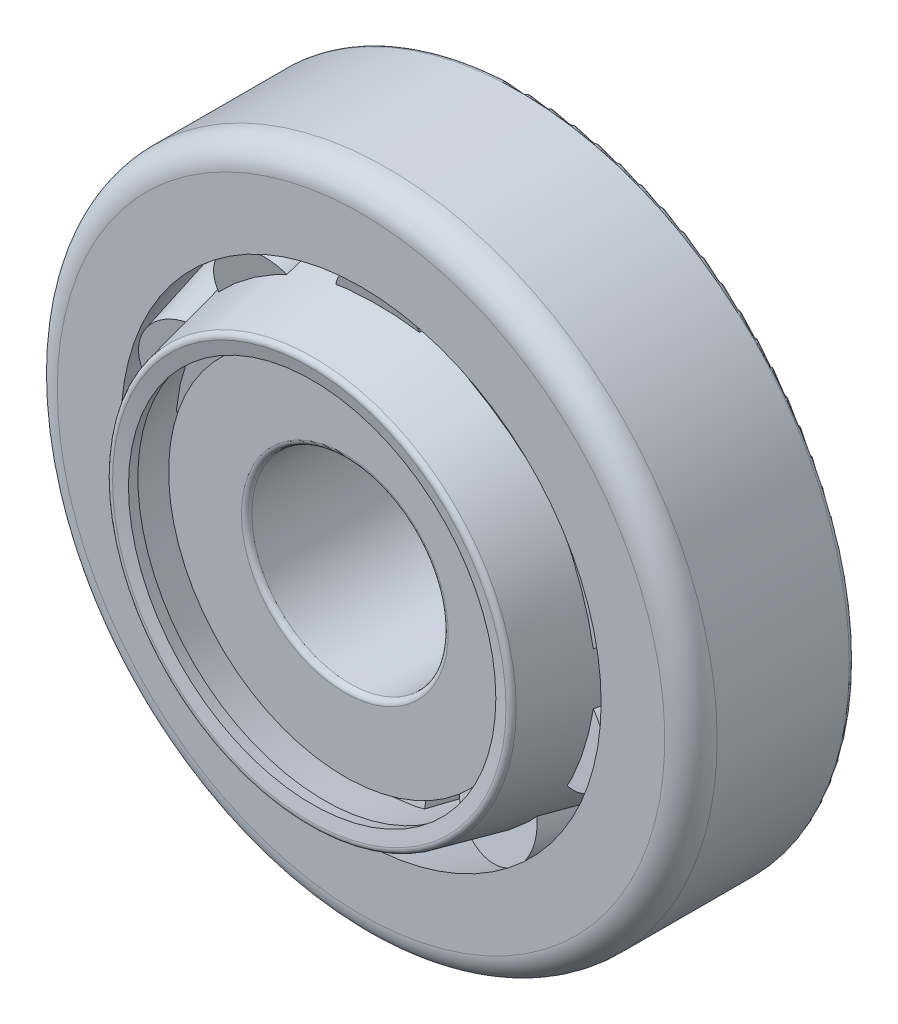
ISO-10303-21;
HEADER;
FILE_DESCRIPTION(('STEP AP214'),'2;1');
FILE_NAME('part.step','',(''),(''),'','','');
FILE_SCHEMA(('AUTOMOTIVE_DESIGN { 1 0 10303 214 1 1 1 1 }'));
ENDSEC;
DATA;
#1=APPLICATION_CONTEXT('core data for automotive mechanical design processes');
#2=APPLICATION_PROTOCOL_DEFINITION('international standard','automotive_design',2000,#1);
#3=PRODUCT_CONTEXT('',#1,'mechanical');
#4=PRODUCT('Part','Part','',(#3));
#5=PRODUCT_RELATED_PRODUCT_CATEGORY('part','',(#4));
#6=PRODUCT_DEFINITION_FORMATION('','',#4);
#7=PRODUCT_DEFINITION_CONTEXT('part definition',#1,'design');
#8=PRODUCT_DEFINITION('design','',#6,#7);
#9=PRODUCT_DEFINITION_SHAPE('','',#8);
#10=(LENGTH_UNIT() NAMED_UNIT(*) SI_UNIT(.MILLI.,.METRE.));
#11=(NAMED_UNIT(*) PLANE_ANGLE_UNIT() SI_UNIT($,.RADIAN.));
#12=(NAMED_UNIT(*) SI_UNIT($,.STERADIAN.) SOLID_ANGLE_UNIT());
#13=UNCERTAINTY_MEASURE_WITH_UNIT(LENGTH_MEASURE(1.E-05),#10,'distance_accuracy_value','');
#14=(GEOMETRIC_REPRESENTATION_CONTEXT(3) GLOBAL_UNCERTAINTY_ASSIGNED_CONTEXT((#13)) GLOBAL_UNIT_ASSIGNED_CONTEXT((#10,
#11,#12)) REPRESENTATION_CONTEXT('',''));
#15=CARTESIAN_POINT('',(0.,0.,0.));
#16=DIRECTION('',(0.,0.,1.));
#17=DIRECTION('',(1.,0.,0.));
#18=AXIS2_PLACEMENT_3D('',#15,#16,#17);
#19=CARTESIAN_POINT('',(-5.69770658490756,7.84222033161654,3.01539041958447));
#20=DIRECTION('',(-0.126366631966676,0.173928747589772,-0.976616744218146));
#21=DIRECTION('',(-0.574040919393306,0.790099543063619,0.214987755262359));
#22=AXIS2_PLACEMENT_3D('',#19,#20,#21);
#23=CONICAL_SURFACE('',#22,2.135,0.0472526995356201);
#24=CARTESIAN_POINT('',(-6.60628266874796,9.092768026787,-4.006483971344));
#25=DIRECTION('',(0.126366631966676,-0.173928747589772,0.976616744218146));
#26=DIRECTION('',(0.574040919393306,-0.790099543063619,-0.214987755262359));
#27=AXIS2_PLACEMENT_3D('',#24,#25,#26);
#28=CIRCLE('',#27,2.475);
#29=CARTESIAN_POINT('',(-5.18553139324953,7.13727165770454,-4.53857866561833));
#30=VERTEX_POINT('',#29);
#31=EDGE_CURVE('E11',#30,#30,#28,.T.);
#32=ORIENTED_EDGE('',*,*,#31,.T.);
#33=EDGE_LOOP('',(#32));
#34=FACE_BOUND('',#33,.T.);
#35=CARTESIAN_POINT('',(-5.69770658490756,7.84222033161654,3.01539041958447));
#36=DIRECTION('',(0.126366631966676,-0.173928747589772,0.976616744218146));
#37=DIRECTION('',(0.574040919393306,-0.790099543063619,-0.214987755262359));
#38=AXIS2_PLACEMENT_3D('',#35,#36,#37);
#39=CIRCLE('',#38,2.135);
#40=CARTESIAN_POINT('',(-4.47212922200285,6.15535780717571,2.55639156209934));
#41=VERTEX_POINT('',#40);
#42=EDGE_CURVE('E45',#41,#41,#39,.T.);
#43=ORIENTED_EDGE('',*,*,#42,.F.);
#44=EDGE_LOOP('',(#43));
#45=FACE_BOUND('',#44,.T.);
#46=ADVANCED_FACE('F39',(#34,#45),#23,.T.);
#47=CARTESIAN_POINT('',(-5.18553139324953,7.13727165770454,-4.53857866561833));
#48=DIRECTION('',(-0.126366631966676,0.173928747589772,-0.976616744218146));
#49=DIRECTION('',(-0.574040919393306,0.790099543063619,0.214987755262359));
#50=AXIS2_PLACEMENT_3D('',#47,#48,#49);
#51=PLANE('',#50);
#52=ORIENTED_EDGE('',*,*,#31,.F.);
#53=EDGE_LOOP('',(#52));
#54=FACE_BOUND('',#53,.T.);
#55=ADVANCED_FACE('F54',(#54),#51,.T.);
#56=CARTESIAN_POINT('',(-5.69770658490756,7.84222033161654,3.01539041958447));
#57=DIRECTION('',(0.126366631966676,-0.173928747589772,0.976616744218146));
#58=DIRECTION('',(0.574040919393306,-0.790099543063619,-0.214987755262359));
#59=AXIS2_PLACEMENT_3D('',#56,#57,#58);
#60=PLANE('',#59);
#61=ORIENTED_EDGE('',*,*,#42,.T.);
#62=EDGE_LOOP('',(#61));
#63=FACE_BOUND('',#62,.T.);
#64=ADVANCED_FACE('F51',(#63),#60,.T.);
#65=CLOSED_SHELL('',(#46,#55,#64));
#66=MANIFOLD_SOLID_BREP('B2',#65);
#67=CARTESIAN_POINT('',(-9.21908291230466,2.99546161941212,3.01539041958447));
#68=DIRECTION('',(-0.204465505565933,0.0664348699585932,-0.976616744218146));
#69=DIRECTION('',(-0.928817718511622,0.301791170954549,0.214987755262359));
#70=AXIS2_PLACEMENT_3D('',#67,#68,#69);
#71=CONICAL_SURFACE('',#70,2.135,0.0472526995356201);
#72=CARTESIAN_POINT('',(-10.6891898973237,3.47312833441441,-4.006483971344));
#73=DIRECTION('',(0.204465505565933,-0.0664348699585932,0.976616744218146));
#74=DIRECTION('',(0.928817718511622,-0.301791170954549,-0.214987755262359));
#75=AXIS2_PLACEMENT_3D('',#72,#73,#74);
#76=CIRCLE('',#75,2.475);
#77=CARTESIAN_POINT('',(-8.39036604400745,2.7261951863019,-4.53857866561833));
#78=VERTEX_POINT('',#77);
#79=EDGE_CURVE('E38',#78,#78,#76,.T.);
#80=ORIENTED_EDGE('',*,*,#79,.T.);
#81=EDGE_LOOP('',(#80));
#82=FACE_BOUND('',#81,.T.);
#83=CARTESIAN_POINT('',(-9.21908291230466,2.99546161941212,3.01539041958447));
#84=DIRECTION('',(0.204465505565933,-0.0664348699585932,0.976616744218146));
#85=DIRECTION('',(0.928817718511622,-0.301791170954549,-0.214987755262359));
#86=AXIS2_PLACEMENT_3D('',#83,#84,#85);
#87=CIRCLE('',#86,2.135);
#88=CARTESIAN_POINT('',(-7.23605708328235,2.35113746942416,2.55639156209934));
#89=VERTEX_POINT('',#88);
#90=EDGE_CURVE('E93',#89,#89,#87,.T.);
#91=ORIENTED_EDGE('',*,*,#90,.F.);
#92=EDGE_LOOP('',(#91));
#93=FACE_BOUND('',#92,.T.);
#94=ADVANCED_FACE('F87',(#82,#93),#71,.T.);
#95=CARTESIAN_POINT('',(-8.39036604400745,2.7261951863019,-4.53857866561833));
#96=DIRECTION('',(-0.204465505565933,0.0664348699585932,-0.976616744218146));
#97=DIRECTION('',(-0.928817718511622,0.301791170954549,0.214987755262359));
#98=AXIS2_PLACEMENT_3D('',#95,#96,#97);
#99=PLANE('',#98);
#100=ORIENTED_EDGE('',*,*,#79,.F.);
#101=EDGE_LOOP('',(#100));
#102=FACE_BOUND('',#101,.T.);
#103=ADVANCED_FACE('F102',(#102),#99,.T.);
#104=CARTESIAN_POINT('',(-9.21908291230466,2.99546161941212,3.01539041958447));
#105=DIRECTION('',(0.204465505565933,-0.0664348699585932,0.976616744218146));
#106=DIRECTION('',(0.928817718511622,-0.301791170954549,-0.214987755262359));
#107=AXIS2_PLACEMENT_3D('',#104,#105,#106);
#108=PLANE('',#107);
#109=ORIENTED_EDGE('',*,*,#90,.T.);
#110=EDGE_LOOP('',(#109));
#111=FACE_BOUND('',#110,.T.);
#112=ADVANCED_FACE('F99',(#111),#108,.T.);
#113=CLOSED_SHELL('',(#94,#103,#112));
#114=MANIFOLD_SOLID_BREP('B6',#113);
#115=CARTESIAN_POINT('',(-9.21908291230472,-2.99546161941193,3.01539041958447));
#116=DIRECTION('',(-0.204465505565935,-0.0664348699585889,-0.976616744218146));
#117=DIRECTION('',(-0.928817718511628,-0.30179117095453,0.214987755262359));
#118=AXIS2_PLACEMENT_3D('',#115,#116,#117);
#119=CONICAL_SURFACE('',#118,2.135,0.0472526995356201);
#120=CARTESIAN_POINT('',(-10.6891898973238,-3.47312833441418,-4.006483971344));
#121=DIRECTION('',(0.204465505565935,0.0664348699585889,0.976616744218146));
#122=DIRECTION('',(0.928817718511628,0.30179117095453,-0.214987755262359));
#123=AXIS2_PLACEMENT_3D('',#120,#121,#122);
#124=CIRCLE('',#123,2.475);
#125=CARTESIAN_POINT('',(-8.39036604400751,-2.72619518630172,-4.53857866561833));
#126=VERTEX_POINT('',#125);
#127=EDGE_CURVE('E86',#126,#126,#124,.T.);
#128=ORIENTED_EDGE('',*,*,#127,.T.);
#129=EDGE_LOOP('',(#128));
#130=FACE_BOUND('',#129,.T.);
#131=CARTESIAN_POINT('',(-9.21908291230472,-2.99546161941193,3.01539041958447));
#132=DIRECTION('',(0.204465505565935,0.0664348699585889,0.976616744218146));
#133=DIRECTION('',(0.928817718511628,0.30179117095453,-0.214987755262359));
#134=AXIS2_PLACEMENT_3D('',#131,#132,#133);
#135=CIRCLE('',#134,2.135);
#136=CARTESIAN_POINT('',(-7.2360570832824,-2.35113746942401,2.55639156209934));
#137=VERTEX_POINT('',#136);
#138=EDGE_CURVE('E141',#137,#137,#135,.T.);
#139=ORIENTED_EDGE('',*,*,#138,.F.);
#140=EDGE_LOOP('',(#139));
#141=FACE_BOUND('',#140,.T.);
#142=ADVANCED_FACE('F135',(#130,#141),#119,.T.);
#143=CARTESIAN_POINT('',(-8.39036604400751,-2.72619518630172,-4.53857866561833));
#144=DIRECTION('',(-0.204465505565935,-0.0664348699585889,-0.976616744218146));
#145=DIRECTION('',(-0.928817718511628,-0.30179117095453,0.214987755262359));
#146=AXIS2_PLACEMENT_3D('',#143,#144,#145);
#147=PLANE('',#146);
#148=ORIENTED_EDGE('',*,*,#127,.F.);
#149=EDGE_LOOP('',(#148));
#150=FACE_BOUND('',#149,.T.);
#151=ADVANCED_FACE('F150',(#150),#147,.T.);
#152=CARTESIAN_POINT('',(-9.21908291230472,-2.99546161941193,3.01539041958447));
#153=DIRECTION('',(0.204465505565935,0.0664348699585889,0.976616744218146));
#154=DIRECTION('',(0.928817718511628,0.30179117095453,-0.214987755262359));
#155=AXIS2_PLACEMENT_3D('',#152,#153,#154);
#156=PLANE('',#155);
#157=ORIENTED_EDGE('',*,*,#138,.T.);
#158=EDGE_LOOP('',(#157));
#159=FACE_BOUND('',#158,.T.);
#160=ADVANCED_FACE('F147',(#159),#156,.T.);
#161=CLOSED_SHELL('',(#142,#151,#160));
#162=MANIFOLD_SOLID_BREP('B33',#161);
#163=CARTESIAN_POINT('',(-5.69770658490774,-7.84222033161642,3.01539041958447));
#164=DIRECTION('',(-0.126366631966679,-0.173928747589769,-0.976616744218146));
#165=DIRECTION('',(-0.574040919393324,-0.790099543063607,0.214987755262359));
#166=AXIS2_PLACEMENT_3D('',#163,#164,#165);
#167=CONICAL_SURFACE('',#166,2.135,0.0472526995356201);
#168=CARTESIAN_POINT('',(-6.60628266874816,-9.09276802678685,-4.006483971344));
#169=DIRECTION('',(0.126366631966679,0.173928747589769,0.976616744218146));
#170=DIRECTION('',(0.574040919393324,0.790099543063607,-0.214987755262359));
#171=AXIS2_PLACEMENT_3D('',#168,#169,#170);
#172=CIRCLE('',#171,2.475);
#173=CARTESIAN_POINT('',(-5.18553139324968,-7.13727165770443,-4.53857866561833));
#174=VERTEX_POINT('',#173);
#175=EDGE_CURVE('E134',#174,#174,#172,.T.);
#176=ORIENTED_EDGE('',*,*,#175,.T.);
#177=EDGE_LOOP('',(#176));
#178=FACE_BOUND('',#177,.T.);
#179=CARTESIAN_POINT('',(-5.69770658490774,-7.84222033161642,3.01539041958447));
#180=DIRECTION('',(0.126366631966679,0.173928747589769,0.976616744218146));
#181=DIRECTION('',(0.574040919393324,0.790099543063607,-0.214987755262359));
#182=AXIS2_PLACEMENT_3D('',#179,#180,#181);
#183=CIRCLE('',#182,2.135);
#184=CARTESIAN_POINT('',(-4.47212922200299,-6.15535780717562,2.55639156209934));
#185=VERTEX_POINT('',#184);
#186=EDGE_CURVE('E189',#185,#185,#183,.T.);
#187=ORIENTED_EDGE('',*,*,#186,.F.);
#188=EDGE_LOOP('',(#187));
#189=FACE_BOUND('',#188,.T.);
#190=ADVANCED_FACE('F183',(#178,#189),#167,.T.);
#191=CARTESIAN_POINT('',(-5.18553139324968,-7.13727165770443,-4.53857866561833));
#192=DIRECTION('',(-0.126366631966679,-0.173928747589769,-0.976616744218146));
#193=DIRECTION('',(-0.574040919393324,-0.790099543063607,0.214987755262359));
#194=AXIS2_PLACEMENT_3D('',#191,#192,#193);
#195=PLANE('',#194);
#196=ORIENTED_EDGE('',*,*,#175,.F.);
#197=EDGE_LOOP('',(#196));
#198=FACE_BOUND('',#197,.T.);
#199=ADVANCED_FACE('F198',(#198),#195,.T.);
#200=CARTESIAN_POINT('',(-5.69770658490774,-7.84222033161642,3.01539041958447));
#201=DIRECTION('',(0.126366631966679,0.173928747589769,0.976616744218146));
#202=DIRECTION('',(0.574040919393324,0.790099543063607,-0.214987755262359));
#203=AXIS2_PLACEMENT_3D('',#200,#201,#202);
#204=PLANE('',#203);
#205=ORIENTED_EDGE('',*,*,#186,.T.);
#206=EDGE_LOOP('',(#205));
#207=FACE_BOUND('',#206,.T.);
#208=ADVANCED_FACE('F195',(#207),#204,.T.);
#209=CLOSED_SHELL('',(#190,#199,#208));
#210=MANIFOLD_SOLID_BREP('B81',#209);
#211=CARTESIAN_POINT('',(0.,-9.6935174244089,3.01539041958447));
#212=DIRECTION('',(0.,-0.214987755262359,-0.976616744218146));
#213=DIRECTION('',(0.,-0.976616744218146,0.214987755262359));
#214=AXIS2_PLACEMENT_3D('',#211,#212,#213);
#215=CONICAL_SURFACE('',#214,2.135,0.0472526995356201);
#216=CARTESIAN_POINT('',(0.,-11.2392793847453,-4.006483971344));
#217=DIRECTION('',(0.,0.214987755262359,0.976616744218146));
#218=DIRECTION('',(0.,0.976616744218146,-0.214987755262359));
#219=AXIS2_PLACEMENT_3D('',#216,#217,#218);
#220=CIRCLE('',#219,2.475);
#221=CARTESIAN_POINT('',(0.,-8.82215294280534,-4.53857866561833));
#222=VERTEX_POINT('',#221);
#223=EDGE_CURVE('E182',#222,#222,#220,.T.);
#224=ORIENTED_EDGE('',*,*,#223,.T.);
#225=EDGE_LOOP('',(#224));
#226=FACE_BOUND('',#225,.T.);
#227=CARTESIAN_POINT('',(0.,-9.6935174244089,3.01539041958447));
#228=DIRECTION('',(0.,0.214987755262359,0.976616744218146));
#229=DIRECTION('',(0.,0.976616744218146,-0.214987755262359));
#230=AXIS2_PLACEMENT_3D('',#227,#228,#229);
#231=CIRCLE('',#230,2.135);
#232=CARTESIAN_POINT('',(0.,-7.60844067550315,2.55639156209934));
#233=VERTEX_POINT('',#232);
#234=EDGE_CURVE('E237',#233,#233,#231,.T.);
#235=ORIENTED_EDGE('',*,*,#234,.F.);
#236=EDGE_LOOP('',(#235));
#237=FACE_BOUND('',#236,.T.);
#238=ADVANCED_FACE('F231',(#226,#237),#215,.T.);
#239=CARTESIAN_POINT('',(0.,-8.82215294280534,-4.53857866561833));
#240=DIRECTION('',(0.,-0.214987755262359,-0.976616744218146));
#241=DIRECTION('',(0.,-0.976616744218146,0.214987755262359));
#242=AXIS2_PLACEMENT_3D('',#239,#240,#241);
#243=PLANE('',#242);
#244=ORIENTED_EDGE('',*,*,#223,.F.);
#245=EDGE_LOOP('',(#244));
#246=FACE_BOUND('',#245,.T.);
#247=ADVANCED_FACE('F246',(#246),#243,.T.);
#248=CARTESIAN_POINT('',(0.,-9.6935174244089,3.01539041958447));
#249=DIRECTION('',(0.,0.214987755262359,0.976616744218146));
#250=DIRECTION('',(0.,0.976616744218146,-0.214987755262359));
#251=AXIS2_PLACEMENT_3D('',#248,#249,#250);
#252=PLANE('',#251);
#253=ORIENTED_EDGE('',*,*,#234,.T.);
#254=EDGE_LOOP('',(#253));
#255=FACE_BOUND('',#254,.T.);
#256=ADVANCED_FACE('F243',(#255),#252,.T.);
#257=CLOSED_SHELL('',(#238,#247,#256));
#258=MANIFOLD_SOLID_BREP('B129',#257);
#259=CARTESIAN_POINT('',(5.69770658490762,-7.8422203316165,3.01539041958447));
#260=DIRECTION('',(0.126366631966677,-0.173928747589771,-0.976616744218146));
#261=DIRECTION('',(0.574040919393312,-0.790099543063615,0.214987755262359));
#262=AXIS2_PLACEMENT_3D('',#259,#260,#261);
#263=CONICAL_SURFACE('',#262,2.135,0.0472526995356201);
#264=CARTESIAN_POINT('',(6.60628266874803,-9.09276802678695,-4.006483971344));
#265=DIRECTION('',(-0.126366631966677,0.173928747589771,0.976616744218146));
#266=DIRECTION('',(-0.574040919393312,0.790099543063615,-0.214987755262359));
#267=AXIS2_PLACEMENT_3D('',#264,#265,#266);
#268=CIRCLE('',#267,2.475);
#269=CARTESIAN_POINT('',(5.18553139324958,-7.1372716577045,-4.53857866561833));
#270=VERTEX_POINT('',#269);
#271=EDGE_CURVE('E230',#270,#270,#268,.T.);
#272=ORIENTED_EDGE('',*,*,#271,.T.);
#273=EDGE_LOOP('',(#272));
#274=FACE_BOUND('',#273,.T.);
#275=CARTESIAN_POINT('',(5.69770658490762,-7.8422203316165,3.01539041958447));
#276=DIRECTION('',(-0.126366631966677,0.173928747589771,0.976616744218146));
#277=DIRECTION('',(-0.574040919393312,0.790099543063615,-0.214987755262359));
#278=AXIS2_PLACEMENT_3D('',#275,#276,#277);
#279=CIRCLE('',#278,2.135);
#280=CARTESIAN_POINT('',(4.4721292220029,-6.15535780717568,2.55639156209934));
#281=VERTEX_POINT('',#280);
#282=EDGE_CURVE('E285',#281,#281,#279,.T.);
#283=ORIENTED_EDGE('',*,*,#282,.F.);
#284=EDGE_LOOP('',(#283));
#285=FACE_BOUND('',#284,.T.);
#286=ADVANCED_FACE('F279',(#274,#285),#263,.T.);
#287=CARTESIAN_POINT('',(5.18553139324958,-7.1372716577045,-4.53857866561833));
#288=DIRECTION('',(0.126366631966677,-0.173928747589771,-0.976616744218146));
#289=DIRECTION('',(0.574040919393312,-0.790099543063615,0.214987755262359));
#290=AXIS2_PLACEMENT_3D('',#287,#288,#289);
#291=PLANE('',#290);
#292=ORIENTED_EDGE('',*,*,#271,.F.);
#293=EDGE_LOOP('',(#292));
#294=FACE_BOUND('',#293,.T.);
#295=ADVANCED_FACE('F294',(#294),#291,.T.);
#296=CARTESIAN_POINT('',(5.69770658490762,-7.8422203316165,3.01539041958447));
#297=DIRECTION('',(-0.126366631966677,0.173928747589771,0.976616744218146));
#298=DIRECTION('',(-0.574040919393312,0.790099543063615,-0.214987755262359));
#299=AXIS2_PLACEMENT_3D('',#296,#297,#298);
#300=PLANE('',#299);
#301=ORIENTED_EDGE('',*,*,#282,.T.);
#302=EDGE_LOOP('',(#301));
#303=FACE_BOUND('',#302,.T.);
#304=ADVANCED_FACE('F291',(#303),#300,.T.);
#305=CLOSED_SHELL('',(#286,#295,#304));
#306=MANIFOLD_SOLID_BREP('B177',#305);
#307=CARTESIAN_POINT('',(9.21908291230468,-2.99546161941206,3.01539041958447));
#308=DIRECTION('',(0.204465505565934,-0.0664348699585918,-0.976616744218146));
#309=DIRECTION('',(0.928817718511624,-0.301791170954542,0.214987755262359));
#310=AXIS2_PLACEMENT_3D('',#307,#308,#309);
#311=CONICAL_SURFACE('',#310,2.135,0.0472526995356201);
#312=CARTESIAN_POINT('',(10.6891898973237,-3.47312833441433,-4.006483971344));
#313=DIRECTION('',(-0.204465505565934,0.0664348699585918,0.976616744218146));
#314=DIRECTION('',(-0.928817718511624,0.301791170954542,-0.214987755262359));
#315=AXIS2_PLACEMENT_3D('',#312,#313,#314);
#316=CIRCLE('',#315,2.475);
#317=CARTESIAN_POINT('',(8.39036604400748,-2.72619518630184,-4.53857866561833));
#318=VERTEX_POINT('',#317);
#319=EDGE_CURVE('E278',#318,#318,#316,.T.);
#320=ORIENTED_EDGE('',*,*,#319,.T.);
#321=EDGE_LOOP('',(#320));
#322=FACE_BOUND('',#321,.T.);
#323=CARTESIAN_POINT('',(9.21908291230468,-2.99546161941206,3.01539041958447));
#324=DIRECTION('',(-0.204465505565934,0.0664348699585918,0.976616744218146));
#325=DIRECTION('',(-0.928817718511624,0.301791170954542,-0.214987755262359));
#326=AXIS2_PLACEMENT_3D('',#323,#324,#325);
#327=CIRCLE('',#326,2.135);
#328=CARTESIAN_POINT('',(7.23605708328237,-2.35113746942411,2.55639156209934));
#329=VERTEX_POINT('',#328);
#330=EDGE_CURVE('E333',#329,#329,#327,.T.);
#331=ORIENTED_EDGE('',*,*,#330,.F.);
#332=EDGE_LOOP('',(#331));
#333=FACE_BOUND('',#332,.T.);
#334=ADVANCED_FACE('F327',(#322,#333),#311,.T.);
#335=CARTESIAN_POINT('',(8.39036604400748,-2.72619518630184,-4.53857866561833));
#336=DIRECTION('',(0.204465505565934,-0.0664348699585918,-0.976616744218146));
#337=DIRECTION('',(0.928817718511624,-0.301791170954542,0.214987755262359));
#338=AXIS2_PLACEMENT_3D('',#335,#336,#337);
#339=PLANE('',#338);
#340=ORIENTED_EDGE('',*,*,#319,.F.);
#341=EDGE_LOOP('',(#340));
#342=FACE_BOUND('',#341,.T.);
#343=ADVANCED_FACE('F342',(#342),#339,.T.);
#344=CARTESIAN_POINT('',(9.21908291230468,-2.99546161941206,3.01539041958447));
#345=DIRECTION('',(-0.204465505565934,0.0664348699585918,0.976616744218146));
#346=DIRECTION('',(-0.928817718511624,0.301791170954542,-0.214987755262359));
#347=AXIS2_PLACEMENT_3D('',#344,#345,#346);
#348=PLANE('',#347);
#349=ORIENTED_EDGE('',*,*,#330,.T.);
#350=EDGE_LOOP('',(#349));
#351=FACE_BOUND('',#350,.T.);
#352=ADVANCED_FACE('F339',(#351),#348,.T.);
#353=CLOSED_SHELL('',(#334,#343,#352));
#354=MANIFOLD_SOLID_BREP('B225',#353);
#355=CARTESIAN_POINT('',(9.2190829123047,2.99546161941199,3.01539041958447));
#356=DIRECTION('',(0.204465505565934,0.0664348699585903,-0.976616744218146));
#357=DIRECTION('',(0.928817718511626,0.301791170954536,0.214987755262359));
#358=AXIS2_PLACEMENT_3D('',#355,#356,#357);
#359=CONICAL_SURFACE('',#358,2.135,0.0472526995356201);
#360=CARTESIAN_POINT('',(10.6891898973238,3.47312833441426,-4.006483971344));
#361=DIRECTION('',(-0.204465505565934,-0.0664348699585903,0.976616744218146));
#362=DIRECTION('',(-0.928817718511626,-0.301791170954536,-0.214987755262359));
#363=AXIS2_PLACEMENT_3D('',#360,#361,#362);
#364=CIRCLE('',#363,2.475);
#365=CARTESIAN_POINT('',(8.39036604400749,2.72619518630178,-4.53857866561833));
#366=VERTEX_POINT('',#365);
#367=EDGE_CURVE('E326',#366,#366,#364,.T.);
#368=ORIENTED_EDGE('',*,*,#367,.T.);
#369=EDGE_LOOP('',(#368));
#370=FACE_BOUND('',#369,.T.);
#371=CARTESIAN_POINT('',(9.2190829123047,2.99546161941199,3.01539041958447));
#372=DIRECTION('',(-0.204465505565934,-0.0664348699585903,0.976616744218146));
#373=DIRECTION('',(-0.928817718511626,-0.301791170954536,-0.214987755262359));
#374=AXIS2_PLACEMENT_3D('',#371,#372,#373);
#375=CIRCLE('',#374,2.135);
#376=CARTESIAN_POINT('',(7.23605708328238,2.35113746942406,2.55639156209934));
#377=VERTEX_POINT('',#376);
#378=EDGE_CURVE('E381',#377,#377,#375,.T.);
#379=ORIENTED_EDGE('',*,*,#378,.F.);
#380=EDGE_LOOP('',(#379));
#381=FACE_BOUND('',#380,.T.);
#382=ADVANCED_FACE('F375',(#370,#381),#359,.T.);
#383=CARTESIAN_POINT('',(8.39036604400749,2.72619518630178,-4.53857866561833));
#384=DIRECTION('',(0.204465505565934,0.0664348699585903,-0.976616744218146));
#385=DIRECTION('',(0.928817718511626,0.301791170954536,0.214987755262359));
#386=AXIS2_PLACEMENT_3D('',#383,#384,#385);
#387=PLANE('',#386);
#388=ORIENTED_EDGE('',*,*,#367,.F.);
#389=EDGE_LOOP('',(#388));
#390=FACE_BOUND('',#389,.T.);
#391=ADVANCED_FACE('F390',(#390),#387,.T.);
#392=CARTESIAN_POINT('',(9.2190829123047,2.99546161941199,3.01539041958447));
#393=DIRECTION('',(-0.204465505565934,-0.0664348699585903,0.976616744218146));
#394=DIRECTION('',(-0.928817718511626,-0.301791170954536,-0.214987755262359));
#395=AXIS2_PLACEMENT_3D('',#392,#393,#394);
#396=PLANE('',#395);
#397=ORIENTED_EDGE('',*,*,#378,.T.);
#398=EDGE_LOOP('',(#397));
#399=FACE_BOUND('',#398,.T.);
#400=ADVANCED_FACE('F387',(#399),#396,.T.);
#401=CLOSED_SHELL('',(#382,#391,#400));
#402=MANIFOLD_SOLID_BREP('B273',#401);
#403=CARTESIAN_POINT('',(5.69770658490768,7.84222033161646,3.01539041958447));
#404=DIRECTION('',(0.126366631966678,0.17392874758977,-0.976616744218146));
#405=DIRECTION('',(0.574040919393318,0.790099543063611,0.214987755262359));
#406=AXIS2_PLACEMENT_3D('',#403,#404,#405);
#407=CONICAL_SURFACE('',#406,2.135,0.0472526995356201);
#408=CARTESIAN_POINT('',(6.60628266874809,9.09276802678691,-4.006483971344));
#409=DIRECTION('',(-0.126366631966678,-0.17392874758977,0.976616744218146));
#410=DIRECTION('',(-0.574040919393318,-0.790099543063611,-0.214987755262359));
#411=AXIS2_PLACEMENT_3D('',#408,#409,#410);
#412=CIRCLE('',#411,2.475);
#413=CARTESIAN_POINT('',(5.18553139324963,7.13727165770447,-4.53857866561833));
#414=VERTEX_POINT('',#413);
#415=EDGE_CURVE('E374',#414,#414,#412,.T.);
#416=ORIENTED_EDGE('',*,*,#415,.T.);
#417=EDGE_LOOP('',(#416));
#418=FACE_BOUND('',#417,.T.);
#419=CARTESIAN_POINT('',(5.69770658490768,7.84222033161646,3.01539041958447));
#420=DIRECTION('',(-0.126366631966678,-0.17392874758977,0.976616744218146));
#421=DIRECTION('',(-0.574040919393318,-0.790099543063611,-0.214987755262359));
#422=AXIS2_PLACEMENT_3D('',#419,#420,#421);
#423=CIRCLE('',#422,2.135);
#424=CARTESIAN_POINT('',(4.47212922200295,6.15535780717565,2.55639156209934));
#425=VERTEX_POINT('',#424);
#426=EDGE_CURVE('E429',#425,#425,#423,.T.);
#427=ORIENTED_EDGE('',*,*,#426,.F.);
#428=EDGE_LOOP('',(#427));
#429=FACE_BOUND('',#428,.T.);
#430=ADVANCED_FACE('F423',(#418,#429),#407,.T.);
#431=CARTESIAN_POINT('',(5.18553139324963,7.13727165770447,-4.53857866561833));
#432=DIRECTION('',(0.126366631966678,0.17392874758977,-0.976616744218146));
#433=DIRECTION('',(0.574040919393318,0.790099543063611,0.214987755262359));
#434=AXIS2_PLACEMENT_3D('',#431,#432,#433);
#435=PLANE('',#434);
#436=ORIENTED_EDGE('',*,*,#415,.F.);
#437=EDGE_LOOP('',(#436));
#438=FACE_BOUND('',#437,.T.);
#439=ADVANCED_FACE('F438',(#438),#435,.T.);
#440=CARTESIAN_POINT('',(5.69770658490768,7.84222033161646,3.01539041958447));
#441=DIRECTION('',(-0.126366631966678,-0.17392874758977,0.976616744218146));
#442=DIRECTION('',(-0.574040919393318,-0.790099543063611,-0.214987755262359));
#443=AXIS2_PLACEMENT_3D('',#440,#441,#442);
#444=PLANE('',#443);
#445=ORIENTED_EDGE('',*,*,#426,.T.);
#446=EDGE_LOOP('',(#445));
#447=FACE_BOUND('',#446,.T.);
#448=ADVANCED_FACE('F435',(#447),#444,.T.);
#449=CLOSED_SHELL('',(#430,#439,#448));
#450=MANIFOLD_SOLID_BREP('B321',#449);
#451=CARTESIAN_POINT('',(0.,9.6935174244089,3.01539041958447));
#452=DIRECTION('',(0.,0.214987755262359,-0.976616744218146));
#453=DIRECTION('',(0.,0.976616744218146,0.214987755262359));
#454=AXIS2_PLACEMENT_3D('',#451,#452,#453);
#455=CONICAL_SURFACE('',#454,2.135,0.0472526995356201);
#456=CARTESIAN_POINT('',(0.,11.2392793847453,-4.006483971344));
#457=DIRECTION('',(0.,-0.214987755262359,0.976616744218146));
#458=DIRECTION('',(0.,-0.976616744218146,-0.214987755262359));
#459=AXIS2_PLACEMENT_3D('',#456,#457,#458);
#460=CIRCLE('',#459,2.475);
#461=CARTESIAN_POINT('',(0.,8.82215294280534,-4.53857866561833));
#462=VERTEX_POINT('',#461);
#463=EDGE_CURVE('E422',#462,#462,#460,.T.);
#464=ORIENTED_EDGE('',*,*,#463,.T.);
#465=EDGE_LOOP('',(#464));
#466=FACE_BOUND('',#465,.T.);
#467=CARTESIAN_POINT('',(0.,9.6935174244089,3.01539041958447));
#468=DIRECTION('',(0.,-0.214987755262359,0.976616744218146));
#469=DIRECTION('',(0.,-0.976616744218146,-0.214987755262359));
#470=AXIS2_PLACEMENT_3D('',#467,#468,#469);
#471=CIRCLE('',#470,2.135);
#472=CARTESIAN_POINT('',(0.,7.60844067550315,2.55639156209934));
#473=VERTEX_POINT('',#472);
#474=EDGE_CURVE('E477',#473,#473,#471,.T.);
#475=ORIENTED_EDGE('',*,*,#474,.F.);
#476=EDGE_LOOP('',(#475));
#477=FACE_BOUND('',#476,.T.);
#478=ADVANCED_FACE('F471',(#466,#477),#455,.T.);
#479=CARTESIAN_POINT('',(0.,8.82215294280534,-4.53857866561833));
#480=DIRECTION('',(0.,0.214987755262359,-0.976616744218146));
#481=DIRECTION('',(0.,0.976616744218146,0.214987755262359));
#482=AXIS2_PLACEMENT_3D('',#479,#480,#481);
#483=PLANE('',#482);
#484=ORIENTED_EDGE('',*,*,#463,.F.);
#485=EDGE_LOOP('',(#484));
#486=FACE_BOUND('',#485,.T.);
#487=ADVANCED_FACE('F486',(#486),#483,.T.);
#488=CARTESIAN_POINT('',(0.,9.6935174244089,3.01539041958447));
#489=DIRECTION('',(0.,-0.214987755262359,0.976616744218146));
#490=DIRECTION('',(0.,-0.976616744218146,-0.214987755262359));
#491=AXIS2_PLACEMENT_3D('',#488,#489,#490);
#492=PLANE('',#491);
#493=ORIENTED_EDGE('',*,*,#474,.T.);
#494=EDGE_LOOP('',(#493));
#495=FACE_BOUND('',#494,.T.);
#496=ADVANCED_FACE('F483',(#495),#492,.T.);
#497=CLOSED_SHELL('',(#478,#487,#496));
#498=MANIFOLD_SOLID_BREP('B369',#497);
#499=CARTESIAN_POINT('',(0.,0.,5.8191873003117));
#500=DIRECTION('',(0.,0.,-1.));
#501=DIRECTION('',(-1.,0.,0.));
#502=AXIS2_PLACEMENT_3D('',#499,#500,#501);
#503=CONICAL_SURFACE('',#502,9.33228873189699,0.216679291909695);
#504=CARTESIAN_POINT('',(0.,0.,-5.27685));
#505=DIRECTION('',(0.,0.,1.));
#506=DIRECTION('',(1.,0.,0.));
#507=AXIS2_PLACEMENT_3D('',#504,#505,#506);
#508=CIRCLE('',#507,11.7749174965832);
#509=CARTESIAN_POINT('',(11.7749174965832,0.,-5.27685));
#510=VERTEX_POINT('',#509);
#511=EDGE_CURVE('E530',#510,#510,#508,.T.);
#512=ORIENTED_EDGE('',*,*,#511,.F.);
#513=EDGE_LOOP('',(#512));
#514=FACE_BOUND('',#513,.T.);
#515=CARTESIAN_POINT('',(0.,0.,5.8191873003117));
#516=DIRECTION('',(0.,0.,1.));
#517=DIRECTION('',(1.,0.,0.));
#518=AXIS2_PLACEMENT_3D('',#515,#516,#517);
#519=CIRCLE('',#518,9.33228873189699);
#520=CARTESIAN_POINT('',(9.33228873189699,0.,5.8191873003117));
#521=VERTEX_POINT('',#520);
#522=EDGE_CURVE('E545',#521,#521,#519,.T.);
#523=ORIENTED_EDGE('',*,*,#522,.T.);
#524=EDGE_LOOP('',(#523));
#525=FACE_BOUND('',#524,.T.);
#526=ADVANCED_FACE('F519',(#514,#525),#503,.F.);
#527=CARTESIAN_POINT('',(0.,0.,-5.27685));
#528=DIRECTION('',(0.,0.,1.));
#529=DIRECTION('',(1.,0.,0.));
#530=AXIS2_PLACEMENT_3D('',#527,#528,#529);
#531=CONICAL_SURFACE('',#530,11.7749174965832,1.35411703488521);
#532=CARTESIAN_POINT('',(0.,0.,-5.14785734684259));
#533=DIRECTION('',(0.,0.,1.));
#534=DIRECTION('',(1.,0.,0.));
#535=AXIS2_PLACEMENT_3D('',#532,#533,#534);
#536=CIRCLE('',#535,12.3608875431141);
#537=CARTESIAN_POINT('',(12.3608875431141,0.,-5.14785734684259));
#538=VERTEX_POINT('',#537);
#539=EDGE_CURVE('E534',#538,#538,#536,.T.);
#540=ORIENTED_EDGE('',*,*,#539,.F.);
#541=EDGE_LOOP('',(#540));
#542=FACE_BOUND('',#541,.T.);
#543=ORIENTED_EDGE('',*,*,#511,.T.);
#544=EDGE_LOOP('',(#543));
#545=FACE_BOUND('',#544,.T.);
#546=ADVANCED_FACE('F569',(#542,#545),#531,.T.);
#547=CARTESIAN_POINT('',(0.,0.,-5.14785734684259));
#548=DIRECTION('',(0.,0.,-1.));
#549=DIRECTION('',(-1.,0.,0.));
#550=AXIS2_PLACEMENT_3D('',#547,#548,#549);
#551=CONICAL_SURFACE('',#550,12.3608875431141,0.216679291909696);
#552=CARTESIAN_POINT('',(0.,0.,6.28608934696859));
#553=DIRECTION('',(0.,0.,1.));
#554=DIRECTION('',(1.,0.,0.));
#555=AXIS2_PLACEMENT_3D('',#552,#553,#554);
#556=CIRCLE('',#555,9.8438730151071);
#557=CARTESIAN_POINT('',(9.8438730151071,0.,6.28608934696859));
#558=VERTEX_POINT('',#557);
#559=EDGE_CURVE('E470',#558,#558,#556,.F.);
#560=ORIENTED_EDGE('',*,*,#559,.T.);
#561=EDGE_LOOP('',(#560));
#562=FACE_BOUND('',#561,.T.);
#563=ORIENTED_EDGE('',*,*,#539,.T.);
#564=EDGE_LOOP('',(#563));
#565=FACE_BOUND('',#564,.T.);
#566=ADVANCED_FACE('F564',(#562,#565),#551,.T.);
#567=CARTESIAN_POINT('',(0.,0.,6.53415));
#568=DIRECTION('',(0.,0.,1.));
#569=DIRECTION('',(1.,0.,0.));
#570=AXIS2_PLACEMENT_3D('',#567,#568,#569);
#571=CONICAL_SURFACE('',#570,9.78926612527046,1.35411703488521);
#572=CARTESIAN_POINT('',(0.,0.,6.47954311016336));
#573=DIRECTION('',(0.,0.,-1.));
#574=DIRECTION('',(-1.,0.,0.));
#575=AXIS2_PLACEMENT_3D('',#572,#573,#574);
#576=CIRCLE('',#575,9.54120547223905);
#577=CARTESIAN_POINT('',(-9.54120547223905,0.,6.47954311016336));
#578=VERTEX_POINT('',#577);
#579=EDGE_CURVE('E526',#578,#578,#576,.F.);
#580=ORIENTED_EDGE('',*,*,#579,.T.);
#581=EDGE_LOOP('',(#580));
#582=FACE_BOUND('',#581,.T.);
#583=CARTESIAN_POINT('',(0.,0.,6.34066102026388));
#584=DIRECTION('',(0.,0.,1.));
#585=DIRECTION('',(1.,0.,0.));
#586=AXIS2_PLACEMENT_3D('',#583,#584,#585);
#587=CIRCLE('',#586,8.91031105547413);
#588=CARTESIAN_POINT('',(8.91031105547413,0.,6.34066102026388));
#589=VERTEX_POINT('',#588);
#590=EDGE_CURVE('E539',#589,#589,#587,.T.);
#591=ORIENTED_EDGE('',*,*,#590,.F.);
#592=EDGE_LOOP('',(#591));
#593=FACE_BOUND('',#592,.T.);
#594=ADVANCED_FACE('F559',(#582,#593),#571,.F.);
#595=CARTESIAN_POINT('',(0.,0.,6.34066102026388));
#596=DIRECTION('',(0.,0.,-1.));
#597=DIRECTION('',(-1.,0.,0.));
#598=AXIS2_PLACEMENT_3D('',#595,#596,#597);
#599=CONICAL_SURFACE('',#598,8.91031105547413,0.216679291909724);
#600=CARTESIAN_POINT('',(0.,0.,5.75469097373299));
#601=DIRECTION('',(0.,0.,1.));
#602=DIRECTION('',(1.,0.,0.));
#603=AXIS2_PLACEMENT_3D('',#600,#601,#602);
#604=CIRCLE('',#603,9.03930370863156);
#605=CARTESIAN_POINT('',(9.03930370863156,0.,5.75469097373299));
#606=VERTEX_POINT('',#605);
#607=EDGE_CURVE('E542',#606,#606,#604,.T.);
#608=ORIENTED_EDGE('',*,*,#607,.F.);
#609=EDGE_LOOP('',(#608));
#610=FACE_BOUND('',#609,.T.);
#611=ORIENTED_EDGE('',*,*,#590,.T.);
#612=EDGE_LOOP('',(#611));
#613=FACE_BOUND('',#612,.T.);
#614=ADVANCED_FACE('F553',(#610,#613),#599,.F.);
#615=CARTESIAN_POINT('',(0.,0.,5.75469097373299));
#616=DIRECTION('',(0.,0.,1.));
#617=DIRECTION('',(1.,0.,0.));
#618=AXIS2_PLACEMENT_3D('',#615,#616,#617);
#619=CONICAL_SURFACE('',#618,9.03930370863156,1.3541170348852);
#620=ORIENTED_EDGE('',*,*,#522,.F.);
#621=EDGE_LOOP('',(#620));
#622=FACE_BOUND('',#621,.T.);
#623=ORIENTED_EDGE('',*,*,#607,.T.);
#624=EDGE_LOOP('',(#623));
#625=FACE_BOUND('',#624,.T.);
#626=ADVANCED_FACE('F550',(#622,#625),#619,.T.);
#627=CARTESIAN_POINT('',(0.,0.,6.23148245713195));
#628=DIRECTION('',(0.,0.,-1.));
#629=DIRECTION('',(-1.,0.,0.));
#630=AXIS2_PLACEMENT_3D('',#627,#628,#629);
#631=TOROIDAL_SURFACE('',#630,9.59581236207569,0.254);
#632=ORIENTED_EDGE('',*,*,#559,.F.);
#633=EDGE_LOOP('',(#632));
#634=FACE_BOUND('',#633,.T.);
#635=ORIENTED_EDGE('',*,*,#579,.F.);
#636=EDGE_LOOP('',(#635));
#637=FACE_BOUND('',#636,.T.);
#638=ADVANCED_FACE('F521',(#634,#637),#631,.T.);
#639=CLOSED_SHELL('',(#526,#546,#566,#594,#614,#626,#638));
#640=MANIFOLD_SOLID_BREP('B417',#639);
#641=CARTESIAN_POINT('',(0.,0.,0.));
#642=DIRECTION('',(0.,0.,1.));
#643=DIRECTION('',(1.,0.,0.));
#644=AXIS2_PLACEMENT_3D('',#641,#642,#643);
#645=CYLINDRICAL_SURFACE('',#644,8.545);
#646=CARTESIAN_POINT('',(0.,0.,4.75615));
#647=DIRECTION('',(0.,0.,1.));
#648=DIRECTION('',(1.,0.,0.));
#649=AXIS2_PLACEMENT_3D('',#646,#647,#648);
#650=CIRCLE('',#649,8.545);
#651=CARTESIAN_POINT('',(8.545,0.,4.75615));
#652=VERTEX_POINT('',#651);
#653=EDGE_CURVE('E652',#652,#652,#650,.T.);
#654=ORIENTED_EDGE('',*,*,#653,.F.);
#655=EDGE_LOOP('',(#654));
#656=FACE_BOUND('',#655,.T.);
#657=CARTESIAN_POINT('',(0.,0.,2.76256126790835));
#658=DIRECTION('',(0.,0.,1.));
#659=DIRECTION('',(1.,0.,0.));
#660=AXIS2_PLACEMENT_3D('',#657,#658,#659);
#661=CIRCLE('',#660,8.545);
#662=CARTESIAN_POINT('',(8.545,0.,2.76256126790835));
#663=VERTEX_POINT('',#662);
#664=EDGE_CURVE('E667',#663,#663,#661,.T.);
#665=ORIENTED_EDGE('',*,*,#664,.T.);
#666=EDGE_LOOP('',(#665));
#667=FACE_BOUND('',#666,.T.);
#668=ADVANCED_FACE('F632',(#656,#667),#645,.T.);
#669=CARTESIAN_POINT('',(0.,8.545,4.75615));
#670=DIRECTION('',(0.,0.,-1.));
#671=DIRECTION('',(-1.,0.,0.));
#672=AXIS2_PLACEMENT_3D('',#669,#670,#671);
#673=PLANE('',#672);
#674=CARTESIAN_POINT('',(0.,0.,4.75615));
#675=DIRECTION('',(0.,0.,-1.));
#676=DIRECTION('',(-1.,0.,0.));
#677=AXIS2_PLACEMENT_3D('',#674,#675,#676);
#678=CIRCLE('',#677,5.0165);
#679=CARTESIAN_POINT('',(-5.0165,0.,4.75615));
#680=VERTEX_POINT('',#679);
#681=EDGE_CURVE('E518',#680,#680,#678,.T.);
#682=ORIENTED_EDGE('',*,*,#681,.T.);
#683=EDGE_LOOP('',(#682));
#684=FACE_BOUND('',#683,.T.);
#685=ORIENTED_EDGE('',*,*,#653,.T.);
#686=EDGE_LOOP('',(#685));
#687=FACE_BOUND('',#686,.T.);
#688=ADVANCED_FACE('F705',(#684,#687),#673,.F.);
#689=CARTESIAN_POINT('',(0.,0.,0.));
#690=DIRECTION('',(0.,0.,1.));
#691=DIRECTION('',(1.,0.,0.));
#692=AXIS2_PLACEMENT_3D('',#689,#690,#691);
#693=CYLINDRICAL_SURFACE('',#692,4.7625);
#694=CARTESIAN_POINT('',(0.,0.,4.50215));
#695=DIRECTION('',(0.,0.,-1.));
#696=DIRECTION('',(-1.,0.,0.));
#697=AXIS2_PLACEMENT_3D('',#694,#695,#696);
#698=CIRCLE('',#697,4.7625);
#699=CARTESIAN_POINT('',(-4.7625,0.,4.50215));
#700=VERTEX_POINT('',#699);
#701=EDGE_CURVE('E639',#700,#700,#698,.F.);
#702=ORIENTED_EDGE('',*,*,#701,.T.);
#703=EDGE_LOOP('',(#702));
#704=FACE_BOUND('',#703,.T.);
#705=CARTESIAN_POINT('',(0.,0.,-4.76885));
#706=DIRECTION('',(0.,0.,1.));
#707=DIRECTION('',(1.,0.,0.));
#708=AXIS2_PLACEMENT_3D('',#705,#706,#707);
#709=CIRCLE('',#708,4.7625);
#710=CARTESIAN_POINT('',(4.7625,0.,-4.76885));
#711=VERTEX_POINT('',#710);
#712=EDGE_CURVE('E643',#711,#711,#709,.F.);
#713=ORIENTED_EDGE('',*,*,#712,.T.);
#714=EDGE_LOOP('',(#713));
#715=FACE_BOUND('',#714,.T.);
#716=ADVANCED_FACE('F699',(#704,#715),#693,.F.);
#717=CARTESIAN_POINT('',(0.,4.7625,-6.03885));
#718=DIRECTION('',(0.,0.,1.));
#719=DIRECTION('',(1.,0.,0.));
#720=AXIS2_PLACEMENT_3D('',#717,#718,#719);
#721=PLANE('',#720);
#722=CARTESIAN_POINT('',(0.,0.,-6.03885));
#723=DIRECTION('',(0.,0.,1.));
#724=DIRECTION('',(1.,0.,0.));
#725=AXIS2_PLACEMENT_3D('',#722,#723,#724);
#726=CIRCLE('',#725,6.0325);
#727=CARTESIAN_POINT('',(6.0325,0.,-6.03885));
#728=VERTEX_POINT('',#727);
#729=EDGE_CURVE('E647',#728,#728,#726,.T.);
#730=ORIENTED_EDGE('',*,*,#729,.T.);
#731=EDGE_LOOP('',(#730));
#732=FACE_BOUND('',#731,.T.);
#733=CARTESIAN_POINT('',(0.,0.,-6.03885));
#734=DIRECTION('',(0.,0.,1.));
#735=DIRECTION('',(1.,0.,0.));
#736=AXIS2_PLACEMENT_3D('',#733,#734,#735);
#737=CIRCLE('',#736,9.975);
#738=CARTESIAN_POINT('',(9.975,0.,-6.03885));
#739=VERTEX_POINT('',#738);
#740=EDGE_CURVE('E655',#739,#739,#737,.T.);
#741=ORIENTED_EDGE('',*,*,#740,.F.);
#742=EDGE_LOOP('',(#741));
#743=FACE_BOUND('',#742,.T.);
#744=ADVANCED_FACE('F694',(#732,#743),#721,.F.);
#745=CARTESIAN_POINT('',(0.,0.,0.));
#746=DIRECTION('',(0.,0.,1.));
#747=DIRECTION('',(1.,0.,0.));
#748=AXIS2_PLACEMENT_3D('',#745,#746,#747);
#749=CYLINDRICAL_SURFACE('',#748,9.975);
#750=CARTESIAN_POINT('',(0.,0.,-4.28479640921691));
#751=DIRECTION('',(0.,0.,1.));
#752=DIRECTION('',(1.,0.,0.));
#753=AXIS2_PLACEMENT_3D('',#750,#751,#752);
#754=CIRCLE('',#753,9.975);
#755=CARTESIAN_POINT('',(9.975,0.,-4.28479640921691));
#756=VERTEX_POINT('',#755);
#757=EDGE_CURVE('E658',#756,#756,#754,.T.);
#758=ORIENTED_EDGE('',*,*,#757,.F.);
#759=EDGE_LOOP('',(#758));
#760=FACE_BOUND('',#759,.T.);
#761=ORIENTED_EDGE('',*,*,#740,.T.);
#762=EDGE_LOOP('',(#761));
#763=FACE_BOUND('',#762,.T.);
#764=ADVANCED_FACE('F688',(#760,#763),#749,.T.);
#765=CARTESIAN_POINT('',(0.,0.,-4.28479640921691));
#766=DIRECTION('',(0.,0.,1.));
#767=DIRECTION('',(1.,0.,0.));
#768=AXIS2_PLACEMENT_3D('',#765,#766,#767);
#769=CONICAL_SURFACE('',#768,9.975,1.3541170348852);
#770=CARTESIAN_POINT('',(0.,0.,-4.53857866561833));
#771=DIRECTION('',(0.,0.,1.));
#772=DIRECTION('',(1.,0.,0.));
#773=AXIS2_PLACEMENT_3D('',#770,#771,#772);
#774=CIRCLE('',#773,8.82215294280534);
#775=CARTESIAN_POINT('',(8.82215294280534,0.,-4.53857866561833));
#776=VERTEX_POINT('',#775);
#777=EDGE_CURVE('E661',#776,#776,#774,.T.);
#778=ORIENTED_EDGE('',*,*,#777,.F.);
#779=EDGE_LOOP('',(#778));
#780=FACE_BOUND('',#779,.T.);
#781=ORIENTED_EDGE('',*,*,#757,.T.);
#782=EDGE_LOOP('',(#781));
#783=FACE_BOUND('',#782,.T.);
#784=ADVANCED_FACE('F682',(#780,#783),#769,.F.);
#785=CARTESIAN_POINT('',(0.,0.,-4.53857866561833));
#786=DIRECTION('',(0.,0.,-1.));
#787=DIRECTION('',(-1.,0.,0.));
#788=AXIS2_PLACEMENT_3D('',#785,#786,#787);
#789=CONICAL_SURFACE('',#788,8.82215294280534,0.169426592374075);
#790=CARTESIAN_POINT('',(0.,0.,2.55639156209934));
#791=DIRECTION('',(0.,0.,1.));
#792=DIRECTION('',(1.,0.,0.));
#793=AXIS2_PLACEMENT_3D('',#790,#791,#792);
#794=CIRCLE('',#793,7.60844067550315);
#795=CARTESIAN_POINT('',(7.60844067550315,0.,2.55639156209934));
#796=VERTEX_POINT('',#795);
#797=EDGE_CURVE('E664',#796,#796,#794,.T.);
#798=ORIENTED_EDGE('',*,*,#797,.F.);
#799=EDGE_LOOP('',(#798));
#800=FACE_BOUND('',#799,.T.);
#801=ORIENTED_EDGE('',*,*,#777,.T.);
#802=EDGE_LOOP('',(#801));
#803=FACE_BOUND('',#802,.T.);
#804=ADVANCED_FACE('F676',(#800,#803),#789,.T.);
#805=CARTESIAN_POINT('',(0.,0.,2.55639156209934));
#806=DIRECTION('',(0.,0.,1.));
#807=DIRECTION('',(1.,0.,0.));
#808=AXIS2_PLACEMENT_3D('',#805,#806,#807);
#809=CONICAL_SURFACE('',#808,7.60844067550315,1.3541170348852);
#810=ORIENTED_EDGE('',*,*,#664,.F.);
#811=EDGE_LOOP('',(#810));
#812=FACE_BOUND('',#811,.T.);
#813=ORIENTED_EDGE('',*,*,#797,.T.);
#814=EDGE_LOOP('',(#813));
#815=FACE_BOUND('',#814,.T.);
#816=ADVANCED_FACE('F672',(#812,#815),#809,.T.);
#817=CARTESIAN_POINT('',(0.,0.,-4.76885));
#818=DIRECTION('',(0.,0.,1.));
#819=DIRECTION('',(1.,0.,0.));
#820=AXIS2_PLACEMENT_3D('',#817,#818,#819);
#821=TOROIDAL_SURFACE('',#820,6.0325,1.27);
#822=ORIENTED_EDGE('',*,*,#712,.F.);
#823=EDGE_LOOP('',(#822));
#824=FACE_BOUND('',#823,.T.);
#825=ORIENTED_EDGE('',*,*,#729,.F.);
#826=EDGE_LOOP('',(#825));
#827=FACE_BOUND('',#826,.T.);
#828=ADVANCED_FACE('F675',(#824,#827),#821,.T.);
#829=CARTESIAN_POINT('',(0.,0.,4.50215));
#830=DIRECTION('',(0.,0.,-1.));
#831=DIRECTION('',(-1.,0.,0.));
#832=AXIS2_PLACEMENT_3D('',#829,#830,#831);
#833=TOROIDAL_SURFACE('',#832,5.0165,0.254);
#834=ORIENTED_EDGE('',*,*,#681,.F.);
#835=EDGE_LOOP('',(#834));
#836=FACE_BOUND('',#835,.T.);
#837=ORIENTED_EDGE('',*,*,#701,.F.);
#838=EDGE_LOOP('',(#837));
#839=FACE_BOUND('',#838,.T.);
#840=ADVANCED_FACE('F634',(#836,#839),#833,.T.);
#841=CLOSED_SHELL('',(#668,#688,#716,#744,#764,#784,#804,#816,#828,#840));
#842=MANIFOLD_SOLID_BREP('B465',#841);
#843=CARTESIAN_POINT('',(0.,0.,0.));
#844=DIRECTION('',(0.,0.,1.));
#845=DIRECTION('',(1.,0.,0.));
#846=AXIS2_PLACEMENT_3D('',#843,#844,#845);
#847=CYLINDRICAL_SURFACE('',#846,16.002);
#848=CARTESIAN_POINT('',(0.,0.,-3.71475));
#849=DIRECTION('',(0.,0.,1.));
#850=DIRECTION('',(1.,0.,0.));
#851=AXIS2_PLACEMENT_3D('',#848,#849,#850);
#852=CIRCLE('',#851,16.002);
#853=CARTESIAN_POINT('',(16.002,0.,-3.71475));
#854=VERTEX_POINT('',#853);
#855=EDGE_CURVE('E790',#854,#854,#852,.T.);
#856=ORIENTED_EDGE('',*,*,#855,.T.);
#857=EDGE_LOOP('',(#856));
#858=FACE_BOUND('',#857,.T.);
#859=CARTESIAN_POINT('',(0.,0.,2.69875));
#860=DIRECTION('',(0.,0.,-1.));
#861=DIRECTION('',(-1.,0.,0.));
#862=AXIS2_PLACEMENT_3D('',#859,#860,#861);
#863=CIRCLE('',#862,16.002);
#864=CARTESIAN_POINT('',(-16.002,0.,2.69875));
#865=VERTEX_POINT('',#864);
#866=EDGE_CURVE('E794',#865,#865,#863,.T.);
#867=ORIENTED_EDGE('',*,*,#866,.T.);
#868=EDGE_LOOP('',(#867));
#869=FACE_BOUND('',#868,.T.);
#870=ADVANCED_FACE('F783',(#858,#869),#847,.T.);
#871=CARTESIAN_POINT('',(0.,16.002,3.96875000000001));
#872=DIRECTION('',(0.,0.,-1.));
#873=DIRECTION('',(-1.,0.,0.));
#874=AXIS2_PLACEMENT_3D('',#871,#872,#873);
#875=PLANE('',#874);
#876=CARTESIAN_POINT('',(0.,0.,3.96875000000001));
#877=DIRECTION('',(0.,0.,-1.));
#878=DIRECTION('',(-1.,0.,0.));
#879=AXIS2_PLACEMENT_3D('',#876,#877,#878);
#880=CIRCLE('',#879,14.732);
#881=CARTESIAN_POINT('',(-14.732,0.,3.96875000000001));
#882=VERTEX_POINT('',#881);
#883=EDGE_CURVE('E798',#882,#882,#880,.F.);
#884=ORIENTED_EDGE('',*,*,#883,.T.);
#885=EDGE_LOOP('',(#884));
#886=FACE_BOUND('',#885,.T.);
#887=CARTESIAN_POINT('',(0.,0.,3.96875000000001));
#888=DIRECTION('',(0.,0.,1.));
#889=DIRECTION('',(1.,0.,0.));
#890=AXIS2_PLACEMENT_3D('',#887,#888,#889);
#891=CIRCLE('',#890,11.645);
#892=CARTESIAN_POINT('',(11.645,0.,3.96875000000001));
#893=VERTEX_POINT('',#892);
#894=EDGE_CURVE('E803',#893,#893,#891,.T.);
#895=ORIENTED_EDGE('',*,*,#894,.F.);
#896=EDGE_LOOP('',(#895));
#897=FACE_BOUND('',#896,.T.);
#898=ADVANCED_FACE('F815',(#886,#897),#875,.F.);
#899=CARTESIAN_POINT('',(0.,0.,3.96875000000001));
#900=DIRECTION('',(0.,0.,-1.));
#901=DIRECTION('',(-1.,0.,0.));
#902=AXIS2_PLACEMENT_3D('',#899,#900,#901);
#903=CONICAL_SURFACE('',#902,11.645,0.263931991445315);
#904=CARTESIAN_POINT('',(0.,0.,-3.96875));
#905=DIRECTION('',(0.,0.,1.));
#906=DIRECTION('',(1.,0.,0.));
#907=AXIS2_PLACEMENT_3D('',#904,#905,#906);
#908=CIRCLE('',#907,13.79);
#909=CARTESIAN_POINT('',(13.79,0.,-3.96875));
#910=VERTEX_POINT('',#909);
#911=EDGE_CURVE('E806',#910,#910,#908,.T.);
#912=ORIENTED_EDGE('',*,*,#911,.F.);
#913=EDGE_LOOP('',(#912));
#914=FACE_BOUND('',#913,.T.);
#915=ORIENTED_EDGE('',*,*,#894,.T.);
#916=EDGE_LOOP('',(#915));
#917=FACE_BOUND('',#916,.T.);
#918=ADVANCED_FACE('F812',(#914,#917),#903,.F.);
#919=CARTESIAN_POINT('',(0.,13.79,-3.96875));
#920=DIRECTION('',(0.,0.,1.));
#921=DIRECTION('',(1.,0.,0.));
#922=AXIS2_PLACEMENT_3D('',#919,#920,#921);
#923=PLANE('',#922);
#924=CARTESIAN_POINT('',(0.,0.,-3.96875));
#925=DIRECTION('',(0.,0.,1.));
#926=DIRECTION('',(1.,0.,0.));
#927=AXIS2_PLACEMENT_3D('',#924,#925,#926);
#928=CIRCLE('',#927,15.748);
#929=CARTESIAN_POINT('',(15.748,0.,-3.96875));
#930=VERTEX_POINT('',#929);
#931=EDGE_CURVE('E631',#930,#930,#928,.F.);
#932=ORIENTED_EDGE('',*,*,#931,.T.);
#933=EDGE_LOOP('',(#932));
#934=FACE_BOUND('',#933,.T.);
#935=ORIENTED_EDGE('',*,*,#911,.T.);
#936=EDGE_LOOP('',(#935));
#937=FACE_BOUND('',#936,.T.);
#938=ADVANCED_FACE('F810',(#934,#937),#923,.F.);
#939=CARTESIAN_POINT('',(0.,0.,2.69875));
#940=DIRECTION('',(0.,0.,-1.));
#941=DIRECTION('',(-1.,0.,0.));
#942=AXIS2_PLACEMENT_3D('',#939,#940,#941);
#943=TOROIDAL_SURFACE('',#942,14.732,1.27);
#944=ORIENTED_EDGE('',*,*,#866,.F.);
#945=EDGE_LOOP('',(#944));
#946=FACE_BOUND('',#945,.T.);
#947=ORIENTED_EDGE('',*,*,#883,.F.);
#948=EDGE_LOOP('',(#947));
#949=FACE_BOUND('',#948,.T.);
#950=ADVANCED_FACE('F827',(#946,#949),#943,.T.);
#951=CARTESIAN_POINT('',(0.,0.,-3.71475));
#952=DIRECTION('',(0.,0.,1.));
#953=DIRECTION('',(1.,0.,0.));
#954=AXIS2_PLACEMENT_3D('',#951,#952,#953);
#955=TOROIDAL_SURFACE('',#954,15.748,0.254);
#956=ORIENTED_EDGE('',*,*,#931,.F.);
#957=EDGE_LOOP('',(#956));
#958=FACE_BOUND('',#957,.T.);
#959=ORIENTED_EDGE('',*,*,#855,.F.);
#960=EDGE_LOOP('',(#959));
#961=FACE_BOUND('',#960,.T.);
#962=ADVANCED_FACE('F785',(#958,#961),#955,.T.);
#963=CLOSED_SHELL('',(#870,#898,#918,#938,#950,#962));
#964=MANIFOLD_SOLID_BREP('B513',#963);
#965=ADVANCED_BREP_SHAPE_REPRESENTATION('',(#18,#66,#114,#162,#210,#258,#306,#354,#402,#450,
#498,#640,#842,#964),#14);
#966=SHAPE_DEFINITION_REPRESENTATION(#9,#965);
ENDSEC;
END-ISO-10303-21;
